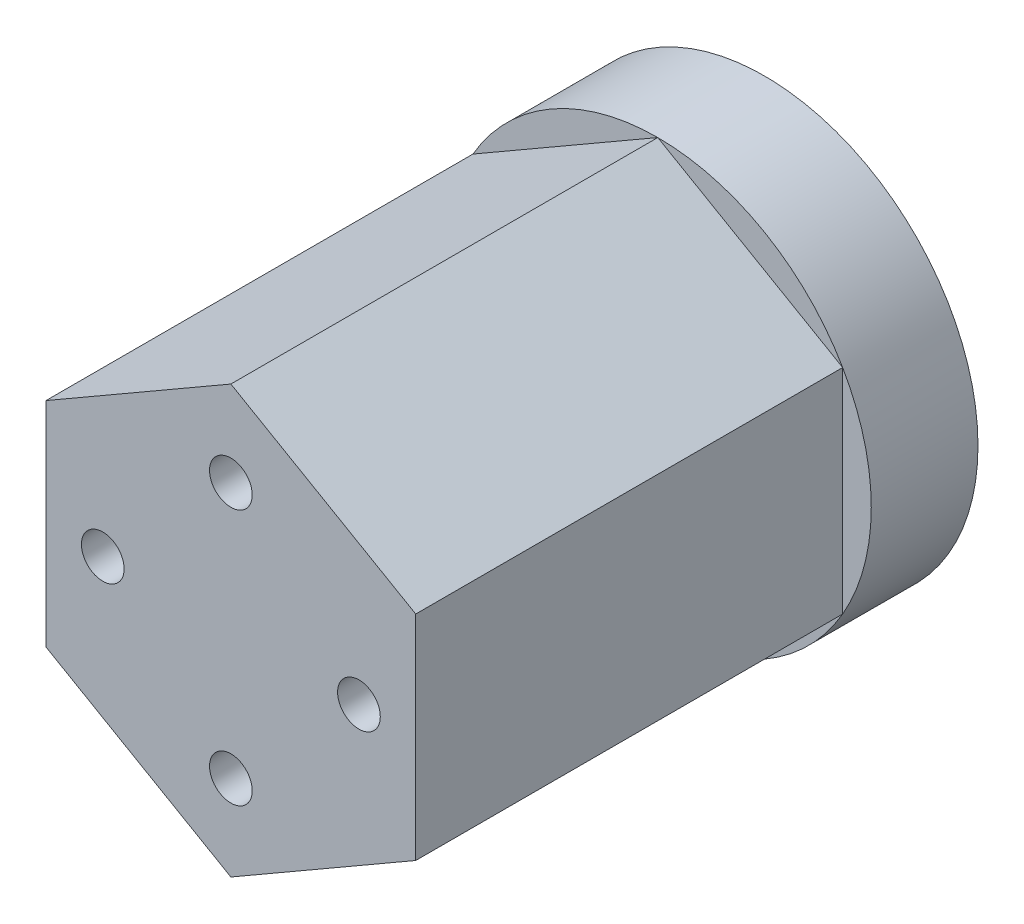
ISO-10303-21;
HEADER;
FILE_DESCRIPTION(('STEP AP214'),'2;1');
FILE_NAME('part.step','',(''),(''),'','','');
FILE_SCHEMA(('AUTOMOTIVE_DESIGN { 1 0 10303 214 1 1 1 1 }'));
ENDSEC;
DATA;
#1=APPLICATION_CONTEXT('core data for automotive mechanical design processes');
#2=APPLICATION_PROTOCOL_DEFINITION('international standard','automotive_design',2000,#1);
#3=PRODUCT_CONTEXT('',#1,'mechanical');
#4=PRODUCT('Part','Part','',(#3));
#5=PRODUCT_RELATED_PRODUCT_CATEGORY('part','',(#4));
#6=PRODUCT_DEFINITION_FORMATION('','',#4);
#7=PRODUCT_DEFINITION_CONTEXT('part definition',#1,'design');
#8=PRODUCT_DEFINITION('design','',#6,#7);
#9=PRODUCT_DEFINITION_SHAPE('','',#8);
#10=(LENGTH_UNIT() NAMED_UNIT(*) SI_UNIT(.MILLI.,.METRE.));
#11=(NAMED_UNIT(*) PLANE_ANGLE_UNIT() SI_UNIT($,.RADIAN.));
#12=(NAMED_UNIT(*) SI_UNIT($,.STERADIAN.) SOLID_ANGLE_UNIT());
#13=UNCERTAINTY_MEASURE_WITH_UNIT(LENGTH_MEASURE(1.E-05),#10,'distance_accuracy_value','');
#14=(GEOMETRIC_REPRESENTATION_CONTEXT(3) GLOBAL_UNCERTAINTY_ASSIGNED_CONTEXT((#13)) GLOBAL_UNIT_ASSIGNED_CONTEXT((#10,
#11,#12)) REPRESENTATION_CONTEXT('',''));
#15=CARTESIAN_POINT('',(0.,0.,0.));
#16=DIRECTION('',(0.,0.,1.));
#17=DIRECTION('',(1.,0.,0.));
#18=AXIS2_PLACEMENT_3D('',#15,#16,#17);
#19=CARTESIAN_POINT('',(0.,0.,5.));
#20=DIRECTION('',(0.,0.,1.));
#21=DIRECTION('',(1.,0.,0.));
#22=AXIS2_PLACEMENT_3D('',#19,#20,#21);
#23=PLANE('',#22);
#24=DIRECTION('',(-0.866025403784441,0.499999999999995,0.));
#25=VECTOR('',#24,1.);
#26=CARTESIAN_POINT('',(8.66025403784433,5.0000000000001,5.));
#27=LINE('',#26,#25);
#28=CARTESIAN_POINT('',(8.66025403784432,5.0000000000001,5.));
#29=VERTEX_POINT('',#28);
#30=CARTESIAN_POINT('',(0.,10.,5.));
#31=VERTEX_POINT('',#30);
#32=EDGE_CURVE('E124',#29,#31,#27,.T.);
#33=ORIENTED_EDGE('',*,*,#32,.F.);
#34=CARTESIAN_POINT('',(0.,0.,5.));
#35=DIRECTION('',(0.,0.,1.));
#36=DIRECTION('',(1.,0.,0.));
#37=AXIS2_PLACEMENT_3D('',#34,#35,#36);
#38=CIRCLE('',#37,10.);
#39=EDGE_CURVE('E11',#29,#31,#38,.T.);
#40=ORIENTED_EDGE('',*,*,#39,.T.);
#41=EDGE_LOOP('',(#33,#40));
#42=FACE_BOUND('',#41,.T.);
#43=ADVANCED_FACE('F44',(#42),#23,.T.);
#44=DIRECTION('',(0.,1.,0.));
#45=VECTOR('',#44,1.);
#46=CARTESIAN_POINT('',(8.66025403784443,-4.99999999999992,5.));
#47=LINE('',#46,#45);
#48=CARTESIAN_POINT('',(8.66025403784444,-4.99999999999991,5.));
#49=VERTEX_POINT('',#48);
#50=EDGE_CURVE('E62',#49,#29,#47,.T.);
#51=ORIENTED_EDGE('',*,*,#50,.F.);
#52=EDGE_CURVE('E54',#49,#29,#38,.T.);
#53=ORIENTED_EDGE('',*,*,#52,.T.);
#54=EDGE_LOOP('',(#51,#53));
#55=FACE_BOUND('',#54,.T.);
#56=ADVANCED_FACE('F233',(#55),#23,.T.);
#57=DIRECTION('',(0.866025403784434,0.500000000000007,0.));
#58=VECTOR('',#57,1.);
#59=CARTESIAN_POINT('',(0.,-10.,5.));
#60=LINE('',#59,#58);
#61=CARTESIAN_POINT('',(0.,-10.,5.));
#62=VERTEX_POINT('',#61);
#63=EDGE_CURVE('E67',#62,#49,#60,.T.);
#64=ORIENTED_EDGE('',*,*,#63,.F.);
#65=EDGE_CURVE('E167',#62,#49,#38,.T.);
#66=ORIENTED_EDGE('',*,*,#65,.T.);
#67=EDGE_LOOP('',(#64,#66));
#68=FACE_BOUND('',#67,.T.);
#69=ADVANCED_FACE('F242',(#68),#23,.T.);
#70=DIRECTION('',(0.866025403784442,-0.499999999999995,0.));
#71=VECTOR('',#70,1.);
#72=CARTESIAN_POINT('',(-8.66025403784436,-5.00000000000004,5.));
#73=LINE('',#72,#71);
#74=CARTESIAN_POINT('',(-8.66025403784436,-5.00000000000004,5.));
#75=VERTEX_POINT('',#74);
#76=EDGE_CURVE('E190',#75,#62,#73,.T.);
#77=ORIENTED_EDGE('',*,*,#76,.F.);
#78=EDGE_CURVE('E169',#75,#62,#38,.T.);
#79=ORIENTED_EDGE('',*,*,#78,.T.);
#80=EDGE_LOOP('',(#77,#79));
#81=FACE_BOUND('',#80,.T.);
#82=ADVANCED_FACE('F246',(#81),#23,.T.);
#83=DIRECTION('',(0.,-1.,0.));
#84=VECTOR('',#83,1.);
#85=CARTESIAN_POINT('',(-8.6602540378444,4.99999999999998,5.));
#86=LINE('',#85,#84);
#87=CARTESIAN_POINT('',(-8.6602540378444,4.99999999999998,5.));
#88=VERTEX_POINT('',#87);
#89=EDGE_CURVE('E181',#88,#75,#86,.T.);
#90=ORIENTED_EDGE('',*,*,#89,.F.);
#91=EDGE_CURVE('E168',#88,#75,#38,.T.);
#92=ORIENTED_EDGE('',*,*,#91,.T.);
#93=EDGE_LOOP('',(#90,#92));
#94=FACE_BOUND('',#93,.T.);
#95=ADVANCED_FACE('F184',(#94),#23,.T.);
#96=CARTESIAN_POINT('',(0.,0.,5.));
#97=DIRECTION('',(0.,0.,-1.));
#98=DIRECTION('',(-1.,0.,0.));
#99=AXIS2_PLACEMENT_3D('',#96,#97,#98);
#100=CYLINDRICAL_SURFACE('',#99,10.);
#101=ORIENTED_EDGE('',*,*,#39,.F.);
#102=ORIENTED_EDGE('',*,*,#52,.F.);
#103=ORIENTED_EDGE('',*,*,#65,.F.);
#104=ORIENTED_EDGE('',*,*,#78,.F.);
#105=ORIENTED_EDGE('',*,*,#91,.F.);
#106=EDGE_CURVE('E53',#31,#88,#38,.T.);
#107=ORIENTED_EDGE('',*,*,#106,.F.);
#108=EDGE_LOOP('',(#101,#102,#103,#104,#105,#107));
#109=FACE_BOUND('',#108,.T.);
#110=CARTESIAN_POINT('',(0.,0.,0.));
#111=DIRECTION('',(0.,0.,1.));
#112=DIRECTION('',(1.,0.,0.));
#113=AXIS2_PLACEMENT_3D('',#110,#111,#112);
#114=CIRCLE('',#113,10.);
#115=CARTESIAN_POINT('',(10.,0.,0.));
#116=VERTEX_POINT('',#115);
#117=EDGE_CURVE('E47',#116,#116,#114,.T.);
#118=ORIENTED_EDGE('',*,*,#117,.T.);
#119=EDGE_LOOP('',(#118));
#120=FACE_BOUND('',#119,.T.);
#121=ADVANCED_FACE('F50',(#109,#120),#100,.T.);
#122=DIRECTION('',(-0.866025403784438,-0.500000000000001,0.));
#123=VECTOR('',#122,1.);
#124=CARTESIAN_POINT('',(0.,10.,5.));
#125=LINE('',#124,#123);
#126=EDGE_CURVE('E182',#31,#88,#125,.T.);
#127=ORIENTED_EDGE('',*,*,#126,.F.);
#128=ORIENTED_EDGE('',*,*,#106,.T.);
#129=EDGE_LOOP('',(#127,#128));
#130=FACE_BOUND('',#129,.T.);
#131=ADVANCED_FACE('F161',(#130),#23,.T.);
#132=CARTESIAN_POINT('',(0.,0.,0.));
#133=DIRECTION('',(0.,0.,1.));
#134=DIRECTION('',(1.,0.,0.));
#135=AXIS2_PLACEMENT_3D('',#132,#133,#134);
#136=PLANE('',#135);
#137=CARTESIAN_POINT('',(0.,7.,0.));
#138=DIRECTION('',(0.,0.,1.));
#139=DIRECTION('',(1.,0.,0.));
#140=AXIS2_PLACEMENT_3D('',#137,#138,#139);
#141=CIRCLE('',#140,1.);
#142=CARTESIAN_POINT('',(1.,7.,0.));
#143=VERTEX_POINT('',#142);
#144=EDGE_CURVE('E137',#143,#143,#141,.F.);
#145=ORIENTED_EDGE('',*,*,#144,.F.);
#146=EDGE_LOOP('',(#145));
#147=FACE_BOUND('',#146,.T.);
#148=CARTESIAN_POINT('',(7.0000000000002,1.97666086873723E-13,0.));
#149=DIRECTION('',(0.,0.,1.));
#150=DIRECTION('',(1.,0.,0.));
#151=AXIS2_PLACEMENT_3D('',#148,#149,#150);
#152=CIRCLE('',#151,1.);
#153=CARTESIAN_POINT('',(8.0000000000002,1.97666086873723E-13,0.));
#154=VERTEX_POINT('',#153);
#155=EDGE_CURVE('E141',#154,#154,#152,.F.);
#156=ORIENTED_EDGE('',*,*,#155,.F.);
#157=EDGE_LOOP('',(#156));
#158=FACE_BOUND('',#157,.T.);
#159=CARTESIAN_POINT('',(3.95332173747447E-13,-7.,0.));
#160=DIRECTION('',(0.,0.,1.));
#161=DIRECTION('',(1.,0.,0.));
#162=AXIS2_PLACEMENT_3D('',#159,#160,#161);
#163=CIRCLE('',#162,1.);
#164=CARTESIAN_POINT('',(1.0000000000004,-7.,0.));
#165=VERTEX_POINT('',#164);
#166=EDGE_CURVE('E148',#165,#165,#163,.F.);
#167=ORIENTED_EDGE('',*,*,#166,.F.);
#168=EDGE_LOOP('',(#167));
#169=FACE_BOUND('',#168,.T.);
#170=CARTESIAN_POINT('',(-6.9999999999998,-1.98523339633126E-13,0.));
#171=DIRECTION('',(0.,0.,1.));
#172=DIRECTION('',(1.,0.,0.));
#173=AXIS2_PLACEMENT_3D('',#170,#171,#172);
#174=CIRCLE('',#173,1.);
#175=CARTESIAN_POINT('',(-5.9999999999998,-1.98523339633126E-13,0.));
#176=VERTEX_POINT('',#175);
#177=EDGE_CURVE('E140',#176,#176,#174,.F.);
#178=ORIENTED_EDGE('',*,*,#177,.F.);
#179=EDGE_LOOP('',(#178));
#180=FACE_BOUND('',#179,.T.);
#181=ORIENTED_EDGE('',*,*,#117,.F.);
#182=EDGE_LOOP('',(#181));
#183=FACE_BOUND('',#182,.T.);
#184=ADVANCED_FACE('F158',(#147,#158,#169,#180,#183),#136,.F.);
#185=CARTESIAN_POINT('',(-6.9999999999998,-1.98523339633126E-13,-0.00100000000000013));
#186=DIRECTION('',(0.,0.,1.));
#187=DIRECTION('',(1.,0.,0.));
#188=AXIS2_PLACEMENT_3D('',#185,#186,#187);
#189=CYLINDRICAL_SURFACE('',#188,1.);
#190=CARTESIAN_POINT('',(-6.9999999999998,-1.98523339633126E-13,5.));
#191=DIRECTION('',(0.,0.,1.));
#192=DIRECTION('',(1.,0.,0.));
#193=AXIS2_PLACEMENT_3D('',#190,#191,#192);
#194=CIRCLE('',#193,1.);
#195=CARTESIAN_POINT('',(-5.9999999999998,-1.98523339633126E-13,5.));
#196=VERTEX_POINT('',#195);
#197=EDGE_CURVE('E127',#196,#196,#194,.T.);
#198=ORIENTED_EDGE('',*,*,#197,.T.);
#199=EDGE_LOOP('',(#198));
#200=FACE_BOUND('',#199,.T.);
#201=ORIENTED_EDGE('',*,*,#177,.T.);
#202=EDGE_LOOP('',(#201));
#203=FACE_BOUND('',#202,.T.);
#204=ADVANCED_FACE('F156',(#200,#203),#189,.F.);
#205=CARTESIAN_POINT('',(3.95332173747447E-13,-7.,-0.00100000000000013));
#206=DIRECTION('',(0.,0.,1.));
#207=DIRECTION('',(1.,0.,0.));
#208=AXIS2_PLACEMENT_3D('',#205,#206,#207);
#209=CYLINDRICAL_SURFACE('',#208,1.);
#210=CARTESIAN_POINT('',(3.95332173747447E-13,-7.,5.));
#211=DIRECTION('',(0.,0.,1.));
#212=DIRECTION('',(1.,0.,0.));
#213=AXIS2_PLACEMENT_3D('',#210,#211,#212);
#214=CIRCLE('',#213,1.);
#215=CARTESIAN_POINT('',(1.0000000000004,-7.,5.));
#216=VERTEX_POINT('',#215);
#217=EDGE_CURVE('E129',#216,#216,#214,.T.);
#218=ORIENTED_EDGE('',*,*,#217,.T.);
#219=EDGE_LOOP('',(#218));
#220=FACE_BOUND('',#219,.T.);
#221=ORIENTED_EDGE('',*,*,#166,.T.);
#222=EDGE_LOOP('',(#221));
#223=FACE_BOUND('',#222,.T.);
#224=ADVANCED_FACE('F482',(#220,#223),#209,.F.);
#225=CARTESIAN_POINT('',(7.0000000000002,1.97666086873723E-13,-0.00100000000000013));
#226=DIRECTION('',(0.,0.,1.));
#227=DIRECTION('',(1.,0.,0.));
#228=AXIS2_PLACEMENT_3D('',#225,#226,#227);
#229=CYLINDRICAL_SURFACE('',#228,1.);
#230=CARTESIAN_POINT('',(7.0000000000002,1.97666086873723E-13,5.));
#231=DIRECTION('',(0.,0.,1.));
#232=DIRECTION('',(1.,0.,0.));
#233=AXIS2_PLACEMENT_3D('',#230,#231,#232);
#234=CIRCLE('',#233,1.);
#235=CARTESIAN_POINT('',(8.0000000000002,1.97666086873723E-13,5.));
#236=VERTEX_POINT('',#235);
#237=EDGE_CURVE('E138',#236,#236,#234,.T.);
#238=ORIENTED_EDGE('',*,*,#237,.T.);
#239=EDGE_LOOP('',(#238));
#240=FACE_BOUND('',#239,.T.);
#241=ORIENTED_EDGE('',*,*,#155,.T.);
#242=EDGE_LOOP('',(#241));
#243=FACE_BOUND('',#242,.T.);
#244=ADVANCED_FACE('F478',(#240,#243),#229,.F.);
#245=CARTESIAN_POINT('',(0.,7.,-0.00100000000000013));
#246=DIRECTION('',(0.,0.,1.));
#247=DIRECTION('',(1.,0.,0.));
#248=AXIS2_PLACEMENT_3D('',#245,#246,#247);
#249=CYLINDRICAL_SURFACE('',#248,1.);
#250=CARTESIAN_POINT('',(0.,7.,5.));
#251=DIRECTION('',(0.,0.,1.));
#252=DIRECTION('',(1.,0.,0.));
#253=AXIS2_PLACEMENT_3D('',#250,#251,#252);
#254=CIRCLE('',#253,1.);
#255=CARTESIAN_POINT('',(1.,7.,5.));
#256=VERTEX_POINT('',#255);
#257=EDGE_CURVE('E133',#256,#256,#254,.T.);
#258=ORIENTED_EDGE('',*,*,#257,.T.);
#259=EDGE_LOOP('',(#258));
#260=FACE_BOUND('',#259,.T.);
#261=ORIENTED_EDGE('',*,*,#144,.T.);
#262=EDGE_LOOP('',(#261));
#263=FACE_BOUND('',#262,.T.);
#264=ADVANCED_FACE('F226',(#260,#263),#249,.F.);
#265=CARTESIAN_POINT('',(0.,0.,25.));
#266=DIRECTION('',(0.,0.,1.));
#267=DIRECTION('',(1.,0.,0.));
#268=AXIS2_PLACEMENT_3D('',#265,#266,#267);
#269=PLANE('',#268);
#270=CARTESIAN_POINT('',(0.,6.,25.));
#271=DIRECTION('',(0.,0.,1.));
#272=DIRECTION('',(1.,0.,0.));
#273=AXIS2_PLACEMENT_3D('',#270,#271,#272);
#274=CIRCLE('',#273,1.);
#275=CARTESIAN_POINT('',(1.,6.,25.));
#276=VERTEX_POINT('',#275);
#277=EDGE_CURVE('E440',#276,#276,#274,.T.);
#278=ORIENTED_EDGE('',*,*,#277,.F.);
#279=EDGE_LOOP('',(#278));
#280=FACE_BOUND('',#279,.T.);
#281=CARTESIAN_POINT('',(6.00000000000017,1.69428074463191E-13,25.));
#282=DIRECTION('',(0.,0.,1.));
#283=DIRECTION('',(1.,0.,0.));
#284=AXIS2_PLACEMENT_3D('',#281,#282,#283);
#285=CIRCLE('',#284,1.);
#286=CARTESIAN_POINT('',(7.00000000000017,1.69428074463191E-13,25.));
#287=VERTEX_POINT('',#286);
#288=EDGE_CURVE('E439',#287,#287,#285,.T.);
#289=ORIENTED_EDGE('',*,*,#288,.F.);
#290=EDGE_LOOP('',(#289));
#291=FACE_BOUND('',#290,.T.);
#292=CARTESIAN_POINT('',(3.38856148926383E-13,-6.,25.));
#293=DIRECTION('',(0.,0.,1.));
#294=DIRECTION('',(1.,0.,0.));
#295=AXIS2_PLACEMENT_3D('',#292,#293,#294);
#296=CIRCLE('',#295,1.);
#297=CARTESIAN_POINT('',(1.00000000000034,-6.,25.));
#298=VERTEX_POINT('',#297);
#299=EDGE_CURVE('E450',#298,#298,#296,.T.);
#300=ORIENTED_EDGE('',*,*,#299,.F.);
#301=EDGE_LOOP('',(#300));
#302=FACE_BOUND('',#301,.T.);
#303=CARTESIAN_POINT('',(-5.99999999999983,-1.7016286254268E-13,25.));
#304=DIRECTION('',(0.,0.,1.));
#305=DIRECTION('',(1.,0.,0.));
#306=AXIS2_PLACEMENT_3D('',#303,#304,#305);
#307=CIRCLE('',#306,1.);
#308=CARTESIAN_POINT('',(-4.99999999999983,-1.7016286254268E-13,25.));
#309=VERTEX_POINT('',#308);
#310=EDGE_CURVE('E453',#309,#309,#307,.T.);
#311=ORIENTED_EDGE('',*,*,#310,.F.);
#312=EDGE_LOOP('',(#311));
#313=FACE_BOUND('',#312,.T.);
#314=DIRECTION('',(-0.866025403784441,0.499999999999995,0.));
#315=VECTOR('',#314,1.);
#316=CARTESIAN_POINT('',(8.66025403784433,5.0000000000001,25.));
#317=LINE('',#316,#315);
#318=CARTESIAN_POINT('',(8.66025403784433,5.0000000000001,25.));
#319=VERTEX_POINT('',#318);
#320=CARTESIAN_POINT('',(0.,10.,25.));
#321=VERTEX_POINT('',#320);
#322=EDGE_CURVE('E111',#319,#321,#317,.T.);
#323=ORIENTED_EDGE('',*,*,#322,.T.);
#324=DIRECTION('',(-0.866025403784438,-0.500000000000001,0.));
#325=VECTOR('',#324,1.);
#326=CARTESIAN_POINT('',(0.,10.,25.));
#327=LINE('',#326,#325);
#328=CARTESIAN_POINT('',(-8.6602540378444,4.99999999999998,25.));
#329=VERTEX_POINT('',#328);
#330=EDGE_CURVE('E105',#321,#329,#327,.T.);
#331=ORIENTED_EDGE('',*,*,#330,.T.);
#332=DIRECTION('',(0.,-1.,0.));
#333=VECTOR('',#332,1.);
#334=CARTESIAN_POINT('',(-8.6602540378444,4.99999999999998,25.));
#335=LINE('',#334,#333);
#336=CARTESIAN_POINT('',(-8.66025403784436,-5.00000000000004,25.));
#337=VERTEX_POINT('',#336);
#338=EDGE_CURVE('E114',#329,#337,#335,.T.);
#339=ORIENTED_EDGE('',*,*,#338,.T.);
#340=DIRECTION('',(0.866025403784442,-0.499999999999995,0.));
#341=VECTOR('',#340,1.);
#342=CARTESIAN_POINT('',(-8.66025403784436,-5.00000000000004,25.));
#343=LINE('',#342,#341);
#344=CARTESIAN_POINT('',(0.,-10.,25.));
#345=VERTEX_POINT('',#344);
#346=EDGE_CURVE('E195',#337,#345,#343,.T.);
#347=ORIENTED_EDGE('',*,*,#346,.T.);
#348=DIRECTION('',(0.866025403784434,0.500000000000007,0.));
#349=VECTOR('',#348,1.);
#350=CARTESIAN_POINT('',(0.,-10.,25.));
#351=LINE('',#350,#349);
#352=CARTESIAN_POINT('',(8.66025403784443,-4.99999999999992,25.));
#353=VERTEX_POINT('',#352);
#354=EDGE_CURVE('E192',#345,#353,#351,.T.);
#355=ORIENTED_EDGE('',*,*,#354,.T.);
#356=DIRECTION('',(0.,1.,0.));
#357=VECTOR('',#356,1.);
#358=CARTESIAN_POINT('',(8.66025403784443,-4.99999999999992,25.));
#359=LINE('',#358,#357);
#360=EDGE_CURVE('E116',#353,#319,#359,.T.);
#361=ORIENTED_EDGE('',*,*,#360,.T.);
#362=EDGE_LOOP('',(#323,#331,#339,#347,#355,#361));
#363=FACE_BOUND('',#362,.T.);
#364=ADVANCED_FACE('F119',(#280,#291,#302,#313,#363),#269,.T.);
#365=CARTESIAN_POINT('',(8.66025403784443,-4.99999999999992,25.));
#366=DIRECTION('',(-1.,0.,0.));
#367=DIRECTION('',(0.,-1.,0.));
#368=AXIS2_PLACEMENT_3D('',#365,#366,#367);
#369=PLANE('',#368);
#370=ORIENTED_EDGE('',*,*,#50,.T.);
#371=DIRECTION('',(0.,0.,-1.));
#372=VECTOR('',#371,1.);
#373=CARTESIAN_POINT('',(8.66025403784433,5.0000000000001,25.));
#374=LINE('',#373,#372);
#375=EDGE_CURVE('E199',#319,#29,#374,.T.);
#376=ORIENTED_EDGE('',*,*,#375,.F.);
#377=ORIENTED_EDGE('',*,*,#360,.F.);
#378=DIRECTION('',(0.,0.,-1.));
#379=VECTOR('',#378,1.);
#380=CARTESIAN_POINT('',(8.66025403784443,-4.99999999999992,25.));
#381=LINE('',#380,#379);
#382=EDGE_CURVE('E210',#353,#49,#381,.T.);
#383=ORIENTED_EDGE('',*,*,#382,.T.);
#384=EDGE_LOOP('',(#370,#376,#377,#383));
#385=FACE_BOUND('',#384,.T.);
#386=ADVANCED_FACE('F219',(#385),#369,.F.);
#387=CARTESIAN_POINT('',(0.,-10.,25.));
#388=DIRECTION('',(-0.500000000000007,0.866025403784435,0.));
#389=DIRECTION('',(-0.866025403784435,-0.500000000000007,0.));
#390=AXIS2_PLACEMENT_3D('',#387,#388,#389);
#391=PLANE('',#390);
#392=ORIENTED_EDGE('',*,*,#63,.T.);
#393=ORIENTED_EDGE('',*,*,#382,.F.);
#394=ORIENTED_EDGE('',*,*,#354,.F.);
#395=DIRECTION('',(0.,0.,-1.));
#396=VECTOR('',#395,1.);
#397=CARTESIAN_POINT('',(0.,-10.,25.));
#398=LINE('',#397,#396);
#399=EDGE_CURVE('E209',#345,#62,#398,.T.);
#400=ORIENTED_EDGE('',*,*,#399,.T.);
#401=EDGE_LOOP('',(#392,#393,#394,#400));
#402=FACE_BOUND('',#401,.T.);
#403=ADVANCED_FACE('F217',(#402),#391,.F.);
#404=CARTESIAN_POINT('',(-8.66025403784436,-5.00000000000004,25.));
#405=DIRECTION('',(0.499999999999995,0.866025403784442,0.));
#406=DIRECTION('',(-0.866025403784442,0.499999999999995,0.));
#407=AXIS2_PLACEMENT_3D('',#404,#405,#406);
#408=PLANE('',#407);
#409=ORIENTED_EDGE('',*,*,#76,.T.);
#410=ORIENTED_EDGE('',*,*,#399,.F.);
#411=ORIENTED_EDGE('',*,*,#346,.F.);
#412=DIRECTION('',(0.,0.,-1.));
#413=VECTOR('',#412,1.);
#414=CARTESIAN_POINT('',(-8.66025403784436,-5.00000000000004,25.));
#415=LINE('',#414,#413);
#416=EDGE_CURVE('E132',#337,#75,#415,.T.);
#417=ORIENTED_EDGE('',*,*,#416,.T.);
#418=EDGE_LOOP('',(#409,#410,#411,#417));
#419=FACE_BOUND('',#418,.T.);
#420=ADVANCED_FACE('F213',(#419),#408,.F.);
#421=CARTESIAN_POINT('',(-8.6602540378444,4.99999999999998,25.));
#422=DIRECTION('',(1.,0.,0.));
#423=DIRECTION('',(0.,1.,0.));
#424=AXIS2_PLACEMENT_3D('',#421,#422,#423);
#425=PLANE('',#424);
#426=ORIENTED_EDGE('',*,*,#89,.T.);
#427=ORIENTED_EDGE('',*,*,#416,.F.);
#428=ORIENTED_EDGE('',*,*,#338,.F.);
#429=DIRECTION('',(0.,0.,-1.));
#430=VECTOR('',#429,1.);
#431=CARTESIAN_POINT('',(-8.6602540378444,4.99999999999998,25.));
#432=LINE('',#431,#430);
#433=EDGE_CURVE('E109',#329,#88,#432,.T.);
#434=ORIENTED_EDGE('',*,*,#433,.T.);
#435=EDGE_LOOP('',(#426,#427,#428,#434));
#436=FACE_BOUND('',#435,.T.);
#437=ADVANCED_FACE('F194',(#436),#425,.F.);
#438=CARTESIAN_POINT('',(0.,10.,25.));
#439=DIRECTION('',(0.500000000000001,-0.866025403784438,0.));
#440=DIRECTION('',(0.866025403784438,0.500000000000001,0.));
#441=AXIS2_PLACEMENT_3D('',#438,#439,#440);
#442=PLANE('',#441);
#443=ORIENTED_EDGE('',*,*,#126,.T.);
#444=ORIENTED_EDGE('',*,*,#433,.F.);
#445=ORIENTED_EDGE('',*,*,#330,.F.);
#446=DIRECTION('',(0.,0.,-1.));
#447=VECTOR('',#446,1.);
#448=CARTESIAN_POINT('',(0.,10.,25.));
#449=LINE('',#448,#447);
#450=EDGE_CURVE('E110',#321,#31,#449,.T.);
#451=ORIENTED_EDGE('',*,*,#450,.T.);
#452=EDGE_LOOP('',(#443,#444,#445,#451));
#453=FACE_BOUND('',#452,.T.);
#454=ADVANCED_FACE('F104',(#453),#442,.F.);
#455=CARTESIAN_POINT('',(8.66025403784433,5.0000000000001,25.));
#456=DIRECTION('',(-0.499999999999995,-0.866025403784441,0.));
#457=DIRECTION('',(0.866025403784441,-0.499999999999995,0.));
#458=AXIS2_PLACEMENT_3D('',#455,#456,#457);
#459=PLANE('',#458);
#460=ORIENTED_EDGE('',*,*,#32,.T.);
#461=ORIENTED_EDGE('',*,*,#450,.F.);
#462=ORIENTED_EDGE('',*,*,#322,.F.);
#463=ORIENTED_EDGE('',*,*,#375,.T.);
#464=EDGE_LOOP('',(#460,#461,#462,#463));
#465=FACE_BOUND('',#464,.T.);
#466=ADVANCED_FACE('F123',(#465),#459,.F.);
#467=CARTESIAN_POINT('',(0.,0.,5.));
#468=DIRECTION('',(0.,0.,1.));
#469=DIRECTION('',(1.,0.,0.));
#470=AXIS2_PLACEMENT_3D('',#467,#468,#469);
#471=PLANE('',#470);
#472=ORIENTED_EDGE('',*,*,#197,.F.);
#473=EDGE_LOOP('',(#472));
#474=FACE_BOUND('',#473,.T.);
#475=ADVANCED_FACE('F317',(#474),#471,.F.);
#476=ORIENTED_EDGE('',*,*,#217,.F.);
#477=EDGE_LOOP('',(#476));
#478=FACE_BOUND('',#477,.T.);
#479=ADVANCED_FACE('F327',(#478),#471,.F.);
#480=ORIENTED_EDGE('',*,*,#237,.F.);
#481=EDGE_LOOP('',(#480));
#482=FACE_BOUND('',#481,.T.);
#483=ADVANCED_FACE('F340',(#482),#471,.F.);
#484=ORIENTED_EDGE('',*,*,#257,.F.);
#485=EDGE_LOOP('',(#484));
#486=FACE_BOUND('',#485,.T.);
#487=ADVANCED_FACE('F329',(#486),#471,.F.);
#488=CARTESIAN_POINT('',(-5.99999999999983,-1.7016286254268E-13,20.));
#489=DIRECTION('',(0.,0.,1.));
#490=DIRECTION('',(1.,0.,0.));
#491=AXIS2_PLACEMENT_3D('',#488,#489,#490);
#492=CYLINDRICAL_SURFACE('',#491,1.);
#493=CARTESIAN_POINT('',(-5.99999999999983,-1.7016286254268E-13,20.));
#494=DIRECTION('',(0.,0.,1.));
#495=DIRECTION('',(1.,0.,0.));
#496=AXIS2_PLACEMENT_3D('',#493,#494,#495);
#497=CIRCLE('',#496,1.);
#498=CARTESIAN_POINT('',(-4.99999999999983,-1.7016286254268E-13,20.));
#499=VERTEX_POINT('',#498);
#500=EDGE_CURVE('E460',#499,#499,#497,.T.);
#501=ORIENTED_EDGE('',*,*,#500,.F.);
#502=EDGE_LOOP('',(#501));
#503=FACE_BOUND('',#502,.T.);
#504=ORIENTED_EDGE('',*,*,#310,.T.);
#505=EDGE_LOOP('',(#504));
#506=FACE_BOUND('',#505,.T.);
#507=ADVANCED_FACE('F351',(#503,#506),#492,.F.);
#508=CARTESIAN_POINT('',(-5.99999999999983,-1.7016286254268E-13,20.));
#509=DIRECTION('',(0.,0.,1.));
#510=DIRECTION('',(1.,0.,0.));
#511=AXIS2_PLACEMENT_3D('',#508,#509,#510);
#512=PLANE('',#511);
#513=ORIENTED_EDGE('',*,*,#500,.T.);
#514=EDGE_LOOP('',(#513));
#515=FACE_BOUND('',#514,.T.);
#516=ADVANCED_FACE('F362',(#515),#512,.T.);
#517=CARTESIAN_POINT('',(3.38856148926383E-13,-6.,20.));
#518=DIRECTION('',(0.,0.,1.));
#519=DIRECTION('',(1.,0.,0.));
#520=AXIS2_PLACEMENT_3D('',#517,#518,#519);
#521=CYLINDRICAL_SURFACE('',#520,1.);
#522=CARTESIAN_POINT('',(3.38856148926383E-13,-6.,20.));
#523=DIRECTION('',(0.,0.,1.));
#524=DIRECTION('',(1.,0.,0.));
#525=AXIS2_PLACEMENT_3D('',#522,#523,#524);
#526=CIRCLE('',#525,1.);
#527=CARTESIAN_POINT('',(1.00000000000034,-6.,20.));
#528=VERTEX_POINT('',#527);
#529=EDGE_CURVE('E451',#528,#528,#526,.T.);
#530=ORIENTED_EDGE('',*,*,#529,.F.);
#531=EDGE_LOOP('',(#530));
#532=FACE_BOUND('',#531,.T.);
#533=ORIENTED_EDGE('',*,*,#299,.T.);
#534=EDGE_LOOP('',(#533));
#535=FACE_BOUND('',#534,.T.);
#536=ADVANCED_FACE('F375',(#532,#535),#521,.F.);
#537=CARTESIAN_POINT('',(3.38856148926383E-13,-6.,20.));
#538=DIRECTION('',(0.,0.,1.));
#539=DIRECTION('',(1.,0.,0.));
#540=AXIS2_PLACEMENT_3D('',#537,#538,#539);
#541=PLANE('',#540);
#542=ORIENTED_EDGE('',*,*,#529,.T.);
#543=EDGE_LOOP('',(#542));
#544=FACE_BOUND('',#543,.T.);
#545=ADVANCED_FACE('F385',(#544),#541,.T.);
#546=CARTESIAN_POINT('',(6.00000000000017,1.69428074463191E-13,20.));
#547=DIRECTION('',(0.,0.,1.));
#548=DIRECTION('',(1.,0.,0.));
#549=AXIS2_PLACEMENT_3D('',#546,#547,#548);
#550=CYLINDRICAL_SURFACE('',#549,1.);
#551=CARTESIAN_POINT('',(6.00000000000017,1.69428074463191E-13,20.));
#552=DIRECTION('',(0.,0.,1.));
#553=DIRECTION('',(1.,0.,0.));
#554=AXIS2_PLACEMENT_3D('',#551,#552,#553);
#555=CIRCLE('',#554,1.);
#556=CARTESIAN_POINT('',(7.00000000000017,1.69428074463191E-13,20.));
#557=VERTEX_POINT('',#556);
#558=EDGE_CURVE('E443',#557,#557,#555,.T.);
#559=ORIENTED_EDGE('',*,*,#558,.F.);
#560=EDGE_LOOP('',(#559));
#561=FACE_BOUND('',#560,.T.);
#562=ORIENTED_EDGE('',*,*,#288,.T.);
#563=EDGE_LOOP('',(#562));
#564=FACE_BOUND('',#563,.T.);
#565=ADVANCED_FACE('F394',(#561,#564),#550,.F.);
#566=CARTESIAN_POINT('',(6.00000000000017,1.69428074463191E-13,20.));
#567=DIRECTION('',(0.,0.,1.));
#568=DIRECTION('',(1.,0.,0.));
#569=AXIS2_PLACEMENT_3D('',#566,#567,#568);
#570=PLANE('',#569);
#571=ORIENTED_EDGE('',*,*,#558,.T.);
#572=EDGE_LOOP('',(#571));
#573=FACE_BOUND('',#572,.T.);
#574=ADVANCED_FACE('F405',(#573),#570,.T.);
#575=CARTESIAN_POINT('',(0.,6.,20.));
#576=DIRECTION('',(0.,0.,1.));
#577=DIRECTION('',(1.,0.,0.));
#578=AXIS2_PLACEMENT_3D('',#575,#576,#577);
#579=CYLINDRICAL_SURFACE('',#578,1.);
#580=CARTESIAN_POINT('',(0.,6.,20.));
#581=DIRECTION('',(0.,0.,1.));
#582=DIRECTION('',(1.,0.,0.));
#583=AXIS2_PLACEMENT_3D('',#580,#581,#582);
#584=CIRCLE('',#583,1.);
#585=CARTESIAN_POINT('',(1.,6.,20.));
#586=VERTEX_POINT('',#585);
#587=EDGE_CURVE('E203',#586,#586,#584,.T.);
#588=ORIENTED_EDGE('',*,*,#587,.F.);
#589=EDGE_LOOP('',(#588));
#590=FACE_BOUND('',#589,.T.);
#591=ORIENTED_EDGE('',*,*,#277,.T.);
#592=EDGE_LOOP('',(#591));
#593=FACE_BOUND('',#592,.T.);
#594=ADVANCED_FACE('F411',(#590,#593),#579,.F.);
#595=CARTESIAN_POINT('',(0.,6.,20.));
#596=DIRECTION('',(0.,0.,1.));
#597=DIRECTION('',(1.,0.,0.));
#598=AXIS2_PLACEMENT_3D('',#595,#596,#597);
#599=PLANE('',#598);
#600=ORIENTED_EDGE('',*,*,#587,.T.);
#601=EDGE_LOOP('',(#600));
#602=FACE_BOUND('',#601,.T.);
#603=ADVANCED_FACE('F425',(#602),#599,.T.);
#604=CLOSED_SHELL('',(#43,#56,#69,#82,#95,#121,#131,#184,#204,#224,#244,#264,#364,#386,#403,
#420,#437,#454,#466,#475,#479,#483,#487,#507,#516,#536,#545,#565,#574,#594,#603));
#605=MANIFOLD_SOLID_BREP('B2',#604);
#606=ADVANCED_BREP_SHAPE_REPRESENTATION('',(#18,#605),#14);
#607=SHAPE_DEFINITION_REPRESENTATION(#9,#606);
ENDSEC;
END-ISO-10303-21;
